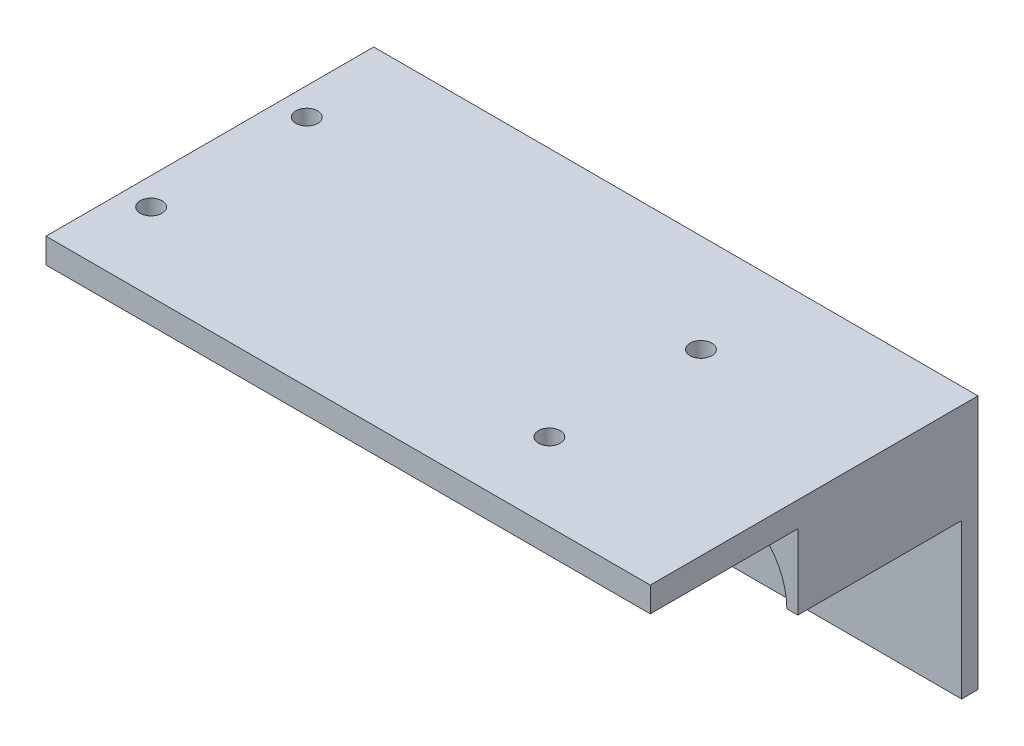
ISO-10303-21;
HEADER;
FILE_DESCRIPTION(('STEP AP214'),'2;1');
FILE_NAME('part.step','',(''),(''),'','','');
FILE_SCHEMA(('AUTOMOTIVE_DESIGN { 1 0 10303 214 1 1 1 1 }'));
ENDSEC;
DATA;
#1=APPLICATION_CONTEXT('core data for automotive mechanical design processes');
#2=APPLICATION_PROTOCOL_DEFINITION('international standard','automotive_design',2000,#1);
#3=PRODUCT_CONTEXT('',#1,'mechanical');
#4=PRODUCT('Part','Part','',(#3));
#5=PRODUCT_RELATED_PRODUCT_CATEGORY('part','',(#4));
#6=PRODUCT_DEFINITION_FORMATION('','',#4);
#7=PRODUCT_DEFINITION_CONTEXT('part definition',#1,'design');
#8=PRODUCT_DEFINITION('design','',#6,#7);
#9=PRODUCT_DEFINITION_SHAPE('','',#8);
#10=(LENGTH_UNIT() NAMED_UNIT(*) SI_UNIT(.MILLI.,.METRE.));
#11=(NAMED_UNIT(*) PLANE_ANGLE_UNIT() SI_UNIT($,.RADIAN.));
#12=(NAMED_UNIT(*) SI_UNIT($,.STERADIAN.) SOLID_ANGLE_UNIT());
#13=UNCERTAINTY_MEASURE_WITH_UNIT(LENGTH_MEASURE(1.E-05),#10,'distance_accuracy_value','');
#14=(GEOMETRIC_REPRESENTATION_CONTEXT(3) GLOBAL_UNCERTAINTY_ASSIGNED_CONTEXT((#13)) GLOBAL_UNIT_ASSIGNED_CONTEXT((#10,
#11,#12)) REPRESENTATION_CONTEXT('',''));
#15=CARTESIAN_POINT('',(0.,0.,0.));
#16=DIRECTION('',(0.,0.,1.));
#17=DIRECTION('',(1.,0.,0.));
#18=AXIS2_PLACEMENT_3D('',#15,#16,#17);
#19=CARTESIAN_POINT('',(60.0592660438776,30.0711771696162,-60.));
#20=DIRECTION('',(0.,0.,1.));
#21=DIRECTION('',(-1.,0.,0.));
#22=AXIS2_PLACEMENT_3D('',#19,#20,#21);
#23=CYLINDRICAL_SURFACE('',#22,11.);
#24=CARTESIAN_POINT('',(60.0592660438776,30.0711771696162,7.00000000000001));
#25=DIRECTION('',(0.,0.,-1.));
#26=DIRECTION('',(-1.,0.,0.));
#27=AXIS2_PLACEMENT_3D('',#24,#25,#26);
#28=CIRCLE('',#27,11.);
#29=CARTESIAN_POINT('',(49.0592660438776,30.0711771696162,7.00000000000001));
#30=VERTEX_POINT('',#29);
#31=EDGE_CURVE('E229',#30,#30,#28,.F.);
#32=ORIENTED_EDGE('',*,*,#31,.T.);
#33=EDGE_LOOP('',(#32));
#34=FACE_BOUND('',#33,.T.);
#35=CARTESIAN_POINT('',(60.0592660438776,30.0711771696162,-3.));
#36=DIRECTION('',(0.,0.,1.));
#37=DIRECTION('',(1.,0.,0.));
#38=AXIS2_PLACEMENT_3D('',#35,#36,#37);
#39=CIRCLE('',#38,11.);
#40=CARTESIAN_POINT('',(71.0592660438776,30.0711771696162,-3.));
#41=VERTEX_POINT('',#40);
#42=EDGE_CURVE('E246',#41,#41,#39,.T.);
#43=ORIENTED_EDGE('',*,*,#42,.F.);
#44=EDGE_LOOP('',(#43));
#45=FACE_BOUND('',#44,.T.);
#46=ADVANCED_FACE('F39',(#34,#45),#23,.F.);
#47=CARTESIAN_POINT('',(60.0592660438776,30.0711771696162,7.));
#48=DIRECTION('',(0.,0.,-1.));
#49=DIRECTION('',(1.,0.,0.));
#50=AXIS2_PLACEMENT_3D('',#47,#48,#49);
#51=CYLINDRICAL_SURFACE('',#50,13.);
#52=CARTESIAN_POINT('',(60.0592660438776,30.0711771696162,0.));
#53=DIRECTION('',(0.,0.,-1.));
#54=DIRECTION('',(-1.,0.,0.));
#55=AXIS2_PLACEMENT_3D('',#52,#53,#54);
#56=CIRCLE('',#55,13.);
#57=CARTESIAN_POINT('',(73.0592660438776,30.0711771696162,0.));
#58=VERTEX_POINT('',#57);
#59=CARTESIAN_POINT('',(55.9092660438776,17.7513760348575,0.));
#60=VERTEX_POINT('',#59);
#61=EDGE_CURVE('E237',#58,#60,#56,.T.);
#62=ORIENTED_EDGE('',*,*,#61,.F.);
#63=DIRECTION('',(0.,0.,-1.));
#64=VECTOR('',#63,1.);
#65=CARTESIAN_POINT('',(73.0592660438776,30.0711771696162,7.));
#66=LINE('',#65,#64);
#67=CARTESIAN_POINT('',(73.0592660438776,30.0711771696162,30.));
#68=VERTEX_POINT('',#67);
#69=EDGE_CURVE('E243',#68,#58,#66,.T.);
#70=ORIENTED_EDGE('',*,*,#69,.F.);
#71=CARTESIAN_POINT('',(60.0592660438776,30.0711771696162,30.));
#72=DIRECTION('',(0.,0.,-1.));
#73=DIRECTION('',(-1.,0.,0.));
#74=AXIS2_PLACEMENT_3D('',#71,#72,#73);
#75=CIRCLE('',#74,13.);
#76=CARTESIAN_POINT('',(49.5967813175664,22.3551928933423,30.));
#77=VERTEX_POINT('',#76);
#78=EDGE_CURVE('E220',#68,#77,#75,.T.);
#79=ORIENTED_EDGE('',*,*,#78,.T.);
#80=DIRECTION('',(0.,0.,-1.));
#81=VECTOR('',#80,1.);
#82=CARTESIAN_POINT('',(49.5967813175664,22.3551928933423,28.5));
#83=LINE('',#82,#81);
#84=CARTESIAN_POINT('',(49.5967813175664,22.3551928933423,5.));
#85=VERTEX_POINT('',#84);
#86=EDGE_CURVE('E211',#77,#85,#83,.T.);
#87=ORIENTED_EDGE('',*,*,#86,.T.);
#88=CARTESIAN_POINT('',(60.0592660438776,30.0711771696162,5.));
#89=DIRECTION('',(0.,0.,-1.));
#90=DIRECTION('',(-1.,0.,0.));
#91=AXIS2_PLACEMENT_3D('',#88,#89,#90);
#92=CIRCLE('',#91,13.);
#93=CARTESIAN_POINT('',(55.9092660438776,17.7513760348575,5.));
#94=VERTEX_POINT('',#93);
#95=EDGE_CURVE('E175',#94,#85,#92,.T.);
#96=ORIENTED_EDGE('',*,*,#95,.F.);
#97=DIRECTION('',(0.,0.,-1.));
#98=VECTOR('',#97,1.);
#99=CARTESIAN_POINT('',(55.9092660438776,17.7513760348575,7.));
#100=LINE('',#99,#98);
#101=EDGE_CURVE('E149',#60,#94,#100,.F.);
#102=ORIENTED_EDGE('',*,*,#101,.F.);
#103=EDGE_LOOP('',(#62,#70,#79,#87,#96,#102));
#104=FACE_BOUND('',#103,.T.);
#105=ADVANCED_FACE('F414',(#104),#51,.T.);
#106=CARTESIAN_POINT('',(47.0592660438776,0.,7.));
#107=DIRECTION('',(-1.,0.,0.));
#108=DIRECTION('',(0.,0.,-1.));
#109=AXIS2_PLACEMENT_3D('',#106,#107,#108);
#110=PLANE('',#109);
#111=DIRECTION('',(0.,-1.,0.));
#112=VECTOR('',#111,1.);
#113=CARTESIAN_POINT('',(47.0592660438776,0.,5.));
#114=LINE('',#113,#112);
#115=CARTESIAN_POINT('',(47.0592660438776,42.,5.));
#116=VERTEX_POINT('',#115);
#117=CARTESIAN_POINT('',(47.0592660438776,31.650981403164,5.));
#118=VERTEX_POINT('',#117);
#119=EDGE_CURVE('E168',#116,#118,#114,.T.);
#120=ORIENTED_EDGE('',*,*,#119,.T.);
#121=DIRECTION('',(0.,0.,-1.));
#122=VECTOR('',#121,1.);
#123=CARTESIAN_POINT('',(47.0592660438776,31.650981403164,57.));
#124=LINE('',#123,#122);
#125=CARTESIAN_POINT('',(47.0592660438776,31.650981403164,30.));
#126=VERTEX_POINT('',#125);
#127=EDGE_CURVE('E11',#126,#118,#124,.T.);
#128=ORIENTED_EDGE('',*,*,#127,.F.);
#129=DIRECTION('',(0.,1.,0.));
#130=VECTOR('',#129,1.);
#131=CARTESIAN_POINT('',(47.0592660438776,30.0711771696162,30.));
#132=LINE('',#131,#130);
#133=CARTESIAN_POINT('',(47.0592660438776,42.,30.));
#134=VERTEX_POINT('',#133);
#135=EDGE_CURVE('E217',#126,#134,#132,.T.);
#136=ORIENTED_EDGE('',*,*,#135,.T.);
#137=DIRECTION('',(0.,0.,-1.));
#138=VECTOR('',#137,1.);
#139=CARTESIAN_POINT('',(47.0592660438776,42.,7.));
#140=LINE('',#139,#138);
#141=EDGE_CURVE('E240',#134,#116,#140,.T.);
#142=ORIENTED_EDGE('',*,*,#141,.T.);
#143=EDGE_LOOP('',(#120,#128,#136,#142));
#144=FACE_BOUND('',#143,.T.);
#145=ADVANCED_FACE('F420',(#144),#110,.T.);
#146=CARTESIAN_POINT('',(60.0592660438776,30.0711771696162,23.));
#147=DIRECTION('',(0.,0.,1.));
#148=DIRECTION('',(-1.,0.,0.));
#149=AXIS2_PLACEMENT_3D('',#146,#147,#148);
#150=PLANE('',#149);
#151=CARTESIAN_POINT('',(60.0592660438776,30.0711771696162,23.));
#152=DIRECTION('',(0.,0.,-1.));
#153=DIRECTION('',(-1.,0.,0.));
#154=AXIS2_PLACEMENT_3D('',#151,#152,#153);
#155=CIRCLE('',#154,4.15);
#156=CARTESIAN_POINT('',(55.9092660438776,30.0711771696162,23.));
#157=VERTEX_POINT('',#156);
#158=EDGE_CURVE('E226',#157,#157,#155,.T.);
#159=ORIENTED_EDGE('',*,*,#158,.T.);
#160=EDGE_LOOP('',(#159));
#161=FACE_BOUND('',#160,.T.);
#162=CARTESIAN_POINT('',(60.0592660438776,30.0711771696162,23.));
#163=DIRECTION('',(0.,0.,-1.));
#164=DIRECTION('',(-1.,0.,0.));
#165=AXIS2_PLACEMENT_3D('',#162,#163,#164);
#166=CIRCLE('',#165,11.);
#167=CARTESIAN_POINT('',(49.0592660438776,30.0711771696162,23.));
#168=VERTEX_POINT('',#167);
#169=EDGE_CURVE('E48',#168,#168,#166,.F.);
#170=ORIENTED_EDGE('',*,*,#169,.T.);
#171=EDGE_LOOP('',(#170));
#172=FACE_BOUND('',#171,.T.);
#173=ADVANCED_FACE('F480',(#161,#172),#150,.T.);
#174=CARTESIAN_POINT('',(0.,0.,0.));
#175=DIRECTION('',(0.,0.,-1.));
#176=DIRECTION('',(1.,0.,0.));
#177=AXIS2_PLACEMENT_3D('',#174,#175,#176);
#178=PLANE('',#177);
#179=DIRECTION('',(1.,0.,0.));
#180=VECTOR('',#179,1.);
#181=CARTESIAN_POINT('',(0.,0.,0.));
#182=LINE('',#181,#180);
#183=CARTESIAN_POINT('',(55.9092660438776,0.,0.));
#184=VERTEX_POINT('',#183);
#185=CARTESIAN_POINT('',(110.639208531659,0.,0.));
#186=VERTEX_POINT('',#185);
#187=EDGE_CURVE('E165',#184,#186,#182,.T.);
#188=ORIENTED_EDGE('',*,*,#187,.T.);
#189=DIRECTION('',(0.,-1.,0.));
#190=VECTOR('',#189,1.);
#191=CARTESIAN_POINT('',(110.639208531659,0.,0.));
#192=LINE('',#191,#190);
#193=CARTESIAN_POINT('',(110.639208531659,28.2999999999964,0.));
#194=VERTEX_POINT('',#193);
#195=EDGE_CURVE('E341',#194,#186,#192,.T.);
#196=ORIENTED_EDGE('',*,*,#195,.F.);
#197=DIRECTION('',(-1.,0.,0.));
#198=VECTOR('',#197,1.);
#199=CARTESIAN_POINT('',(0.,28.2999999999964,0.));
#200=LINE('',#199,#198);
#201=CARTESIAN_POINT('',(108.639208531659,28.2999999999964,0.));
#202=VERTEX_POINT('',#201);
#203=EDGE_CURVE('E251',#194,#202,#200,.T.);
#204=ORIENTED_EDGE('',*,*,#203,.T.);
#205=CARTESIAN_POINT('',(95.6392085316593,28.2999999999999,0.));
#206=DIRECTION('',(0.,0.,1.));
#207=DIRECTION('',(1.,0.,0.));
#208=AXIS2_PLACEMENT_3D('',#205,#206,#207);
#209=CIRCLE('',#208,13.);
#210=CARTESIAN_POINT('',(82.760430195426,30.0711771696162,0.));
#211=VERTEX_POINT('',#210);
#212=EDGE_CURVE('E260',#202,#211,#209,.T.);
#213=ORIENTED_EDGE('',*,*,#212,.T.);
#214=DIRECTION('',(1.,0.,0.));
#215=VECTOR('',#214,1.);
#216=CARTESIAN_POINT('',(0.,30.0711771696162,0.));
#217=LINE('',#216,#215);
#218=EDGE_CURVE('E234',#58,#211,#217,.T.);
#219=ORIENTED_EDGE('',*,*,#218,.F.);
#220=ORIENTED_EDGE('',*,*,#61,.T.);
#221=DIRECTION('',(0.,-1.,0.));
#222=VECTOR('',#221,1.);
#223=CARTESIAN_POINT('',(55.9092660438776,0.,0.));
#224=LINE('',#223,#222);
#225=EDGE_CURVE('E63',#60,#184,#224,.T.);
#226=ORIENTED_EDGE('',*,*,#225,.T.);
#227=EDGE_LOOP('',(#188,#196,#204,#213,#219,#220,#226));
#228=FACE_BOUND('',#227,.T.);
#229=CARTESIAN_POINT('',(85.6392085316545,28.2999999999964,0.));
#230=DIRECTION('',(0.,0.,1.));
#231=DIRECTION('',(1.,0.,0.));
#232=AXIS2_PLACEMENT_3D('',#229,#230,#231);
#233=CIRCLE('',#232,1.54999999999999);
#234=CARTESIAN_POINT('',(87.1892085316545,28.2999999999964,0.));
#235=VERTEX_POINT('',#234);
#236=EDGE_CURVE('E338',#235,#235,#233,.T.);
#237=ORIENTED_EDGE('',*,*,#236,.F.);
#238=EDGE_LOOP('',(#237));
#239=FACE_BOUND('',#238,.T.);
#240=CARTESIAN_POINT('',(95.6392085316592,38.3000000000002,0.));
#241=DIRECTION('',(0.,0.,1.));
#242=DIRECTION('',(1.,0.,0.));
#243=AXIS2_PLACEMENT_3D('',#240,#241,#242);
#244=CIRCLE('',#243,1.54999999999999);
#245=CARTESIAN_POINT('',(97.1892085316592,38.3000000000002,0.));
#246=VERTEX_POINT('',#245);
#247=EDGE_CURVE('E292',#246,#246,#244,.T.);
#248=ORIENTED_EDGE('',*,*,#247,.F.);
#249=EDGE_LOOP('',(#248));
#250=FACE_BOUND('',#249,.T.);
#251=CARTESIAN_POINT('',(105.639208531663,28.2999999999955,0.));
#252=DIRECTION('',(0.,0.,1.));
#253=DIRECTION('',(1.,0.,0.));
#254=AXIS2_PLACEMENT_3D('',#251,#252,#253);
#255=CIRCLE('',#254,1.54999999999999);
#256=CARTESIAN_POINT('',(107.189208531663,28.2999999999955,0.));
#257=VERTEX_POINT('',#256);
#258=EDGE_CURVE('E332',#257,#257,#255,.T.);
#259=ORIENTED_EDGE('',*,*,#258,.F.);
#260=EDGE_LOOP('',(#259));
#261=FACE_BOUND('',#260,.T.);
#262=CARTESIAN_POINT('',(95.6392085316593,28.2999999999999,0.));
#263=DIRECTION('',(0.,0.,1.));
#264=DIRECTION('',(1.,0.,0.));
#265=AXIS2_PLACEMENT_3D('',#262,#263,#264);
#266=CIRCLE('',#265,7.09999999999999);
#267=CARTESIAN_POINT('',(102.739208531659,28.2999999999999,0.));
#268=VERTEX_POINT('',#267);
#269=EDGE_CURVE('E335',#268,#268,#266,.T.);
#270=ORIENTED_EDGE('',*,*,#269,.F.);
#271=EDGE_LOOP('',(#270));
#272=FACE_BOUND('',#271,.T.);
#273=CARTESIAN_POINT('',(95.6392085316584,18.2999999999916,0.));
#274=DIRECTION('',(0.,0.,1.));
#275=DIRECTION('',(1.,0.,0.));
#276=AXIS2_PLACEMENT_3D('',#273,#274,#275);
#277=CIRCLE('',#276,1.54999999999999);
#278=CARTESIAN_POINT('',(97.1892085316584,18.2999999999916,0.));
#279=VERTEX_POINT('',#278);
#280=EDGE_CURVE('E297',#279,#279,#277,.T.);
#281=ORIENTED_EDGE('',*,*,#280,.F.);
#282=EDGE_LOOP('',(#281));
#283=FACE_BOUND('',#282,.T.);
#284=ADVANCED_FACE('F409',(#228,#239,#250,#261,#272,#283),#178,.F.);
#285=CARTESIAN_POINT('',(110.639208531659,42.,57.));
#286=DIRECTION('',(0.,1.,0.));
#287=DIRECTION('',(0.,0.,-1.));
#288=AXIS2_PLACEMENT_3D('',#285,#286,#287);
#289=PLANE('',#288);
#290=CARTESIAN_POINT('',(5.,42.,14.25));
#291=DIRECTION('',(0.,1.,0.));
#292=DIRECTION('',(0.,0.,1.));
#293=AXIS2_PLACEMENT_3D('',#290,#291,#292);
#294=CIRCLE('',#293,2.);
#295=CARTESIAN_POINT('',(5.,42.,16.25));
#296=VERTEX_POINT('',#295);
#297=EDGE_CURVE('E191',#296,#296,#294,.T.);
#298=ORIENTED_EDGE('',*,*,#297,.T.);
#299=EDGE_LOOP('',(#298));
#300=FACE_BOUND('',#299,.T.);
#301=CARTESIAN_POINT('',(77.9098481196518,42.,42.75));
#302=DIRECTION('',(0.,1.,0.));
#303=DIRECTION('',(0.,0.,1.));
#304=AXIS2_PLACEMENT_3D('',#301,#302,#303);
#305=CIRCLE('',#304,2.);
#306=CARTESIAN_POINT('',(77.9098481196518,42.,44.75));
#307=VERTEX_POINT('',#306);
#308=EDGE_CURVE('E195',#307,#307,#305,.T.);
#309=ORIENTED_EDGE('',*,*,#308,.T.);
#310=EDGE_LOOP('',(#309));
#311=FACE_BOUND('',#310,.T.);
#312=CARTESIAN_POINT('',(5.,42.,42.75));
#313=DIRECTION('',(0.,1.,0.));
#314=DIRECTION('',(0.,0.,1.));
#315=AXIS2_PLACEMENT_3D('',#312,#313,#314);
#316=CIRCLE('',#315,2.);
#317=CARTESIAN_POINT('',(5.,42.,44.75));
#318=VERTEX_POINT('',#317);
#319=EDGE_CURVE('E190',#318,#318,#316,.T.);
#320=ORIENTED_EDGE('',*,*,#319,.T.);
#321=EDGE_LOOP('',(#320));
#322=FACE_BOUND('',#321,.T.);
#323=ORIENTED_EDGE('',*,*,#141,.F.);
#324=DIRECTION('',(1.,0.,0.));
#325=VECTOR('',#324,1.);
#326=CARTESIAN_POINT('',(0.,42.,30.));
#327=LINE('',#326,#325);
#328=CARTESIAN_POINT('',(110.639208531659,42.,30.));
#329=VERTEX_POINT('',#328);
#330=EDGE_CURVE('E256',#134,#329,#327,.T.);
#331=ORIENTED_EDGE('',*,*,#330,.T.);
#332=DIRECTION('',(0.,0.,-1.));
#333=VECTOR('',#332,1.);
#334=CARTESIAN_POINT('',(110.639208531659,42.,57.));
#335=LINE('',#334,#333);
#336=CARTESIAN_POINT('',(110.639208531659,42.,57.));
#337=VERTEX_POINT('',#336);
#338=EDGE_CURVE('E289',#337,#329,#335,.T.);
#339=ORIENTED_EDGE('',*,*,#338,.F.);
#340=DIRECTION('',(-1.,0.,0.));
#341=VECTOR('',#340,1.);
#342=CARTESIAN_POINT('',(110.639208531659,42.,57.));
#343=LINE('',#342,#341);
#344=CARTESIAN_POINT('',(0.,42.,57.));
#345=VERTEX_POINT('',#344);
#346=EDGE_CURVE('E271',#337,#345,#343,.T.);
#347=ORIENTED_EDGE('',*,*,#346,.T.);
#348=DIRECTION('',(0.,0.,-1.));
#349=VECTOR('',#348,1.);
#350=CARTESIAN_POINT('',(0.,42.,57.));
#351=LINE('',#350,#349);
#352=CARTESIAN_POINT('',(0.,42.,5.));
#353=VERTEX_POINT('',#352);
#354=EDGE_CURVE('E286',#345,#353,#351,.T.);
#355=ORIENTED_EDGE('',*,*,#354,.T.);
#356=DIRECTION('',(1.,0.,0.));
#357=VECTOR('',#356,1.);
#358=CARTESIAN_POINT('',(0.,42.,5.));
#359=LINE('',#358,#357);
#360=EDGE_CURVE('E152',#353,#116,#359,.T.);
#361=ORIENTED_EDGE('',*,*,#360,.T.);
#362=EDGE_LOOP('',(#323,#331,#339,#347,#355,#361));
#363=FACE_BOUND('',#362,.T.);
#364=ADVANCED_FACE('F396',(#300,#311,#322,#363),#289,.F.);
#365=CARTESIAN_POINT('',(110.639208531659,0.,-3.));
#366=DIRECTION('',(1.,0.,0.));
#367=DIRECTION('',(0.,1.,0.));
#368=AXIS2_PLACEMENT_3D('',#365,#366,#367);
#369=PLANE('',#368);
#370=ORIENTED_EDGE('',*,*,#195,.T.);
#371=DIRECTION('',(0.,0.,1.));
#372=VECTOR('',#371,1.);
#373=CARTESIAN_POINT('',(110.639208531659,0.,-3.));
#374=LINE('',#373,#372);
#375=CARTESIAN_POINT('',(110.639208531659,0.,-3.));
#376=VERTEX_POINT('',#375);
#377=EDGE_CURVE('E329',#376,#186,#374,.T.);
#378=ORIENTED_EDGE('',*,*,#377,.F.);
#379=DIRECTION('',(0.,-1.,0.));
#380=VECTOR('',#379,1.);
#381=CARTESIAN_POINT('',(110.639208531659,0.,-3.));
#382=LINE('',#381,#380);
#383=CARTESIAN_POINT('',(110.639208531659,46.57,-3.));
#384=VERTEX_POINT('',#383);
#385=EDGE_CURVE('E306',#384,#376,#382,.T.);
#386=ORIENTED_EDGE('',*,*,#385,.F.);
#387=DIRECTION('',(0.,0.,-1.));
#388=VECTOR('',#387,1.);
#389=CARTESIAN_POINT('',(110.639208531659,46.57,57.));
#390=LINE('',#389,#388);
#391=CARTESIAN_POINT('',(110.639208531659,46.57,57.));
#392=VERTEX_POINT('',#391);
#393=EDGE_CURVE('E279',#392,#384,#390,.T.);
#394=ORIENTED_EDGE('',*,*,#393,.F.);
#395=DIRECTION('',(0.,-1.,0.));
#396=VECTOR('',#395,1.);
#397=CARTESIAN_POINT('',(110.639208531659,42.,57.));
#398=LINE('',#397,#396);
#399=EDGE_CURVE('E269',#392,#337,#398,.T.);
#400=ORIENTED_EDGE('',*,*,#399,.T.);
#401=ORIENTED_EDGE('',*,*,#338,.T.);
#402=DIRECTION('',(0.,-1.,0.));
#403=VECTOR('',#402,1.);
#404=CARTESIAN_POINT('',(110.639208531659,0.,30.));
#405=LINE('',#404,#403);
#406=CARTESIAN_POINT('',(110.639208531659,28.2999999999964,30.));
#407=VERTEX_POINT('',#406);
#408=EDGE_CURVE('E253',#329,#407,#405,.T.);
#409=ORIENTED_EDGE('',*,*,#408,.T.);
#410=DIRECTION('',(0.,0.,-1.));
#411=VECTOR('',#410,1.);
#412=CARTESIAN_POINT('',(110.639208531659,28.2999999999964,30.));
#413=LINE('',#412,#411);
#414=EDGE_CURVE('E265',#407,#194,#413,.T.);
#415=ORIENTED_EDGE('',*,*,#414,.T.);
#416=EDGE_LOOP('',(#370,#378,#386,#394,#400,#401,#409,#415));
#417=FACE_BOUND('',#416,.T.);
#418=ADVANCED_FACE('F389',(#417),#369,.T.);
#419=CARTESIAN_POINT('',(0.,0.,-3.));
#420=DIRECTION('',(-1.,0.,0.));
#421=DIRECTION('',(0.,-1.,0.));
#422=AXIS2_PLACEMENT_3D('',#419,#420,#421);
#423=PLANE('',#422);
#424=ORIENTED_EDGE('',*,*,#354,.F.);
#425=DIRECTION('',(0.,1.,0.));
#426=VECTOR('',#425,1.);
#427=CARTESIAN_POINT('',(0.,42.,57.));
#428=LINE('',#427,#426);
#429=CARTESIAN_POINT('',(0.,46.57,57.));
#430=VERTEX_POINT('',#429);
#431=EDGE_CURVE('E274',#345,#430,#428,.T.);
#432=ORIENTED_EDGE('',*,*,#431,.T.);
#433=DIRECTION('',(0.,0.,-1.));
#434=VECTOR('',#433,1.);
#435=CARTESIAN_POINT('',(0.,46.57,57.));
#436=LINE('',#435,#434);
#437=CARTESIAN_POINT('',(0.,46.57,-3.));
#438=VERTEX_POINT('',#437);
#439=EDGE_CURVE('E283',#430,#438,#436,.T.);
#440=ORIENTED_EDGE('',*,*,#439,.T.);
#441=DIRECTION('',(0.,1.,0.));
#442=VECTOR('',#441,1.);
#443=CARTESIAN_POINT('',(0.,0.,-3.));
#444=LINE('',#443,#442);
#445=CARTESIAN_POINT('',(0.,0.,-3.));
#446=VERTEX_POINT('',#445);
#447=EDGE_CURVE('E309',#446,#438,#444,.T.);
#448=ORIENTED_EDGE('',*,*,#447,.F.);
#449=DIRECTION('',(0.,0.,1.));
#450=VECTOR('',#449,1.);
#451=CARTESIAN_POINT('',(0.,0.,-3.));
#452=LINE('',#451,#450);
#453=CARTESIAN_POINT('',(0.,0.,5.));
#454=VERTEX_POINT('',#453);
#455=EDGE_CURVE('E348',#446,#454,#452,.T.);
#456=ORIENTED_EDGE('',*,*,#455,.T.);
#457=DIRECTION('',(0.,-1.,0.));
#458=VECTOR('',#457,1.);
#459=CARTESIAN_POINT('',(0.,0.,5.));
#460=LINE('',#459,#458);
#461=EDGE_CURVE('E157',#353,#454,#460,.T.);
#462=ORIENTED_EDGE('',*,*,#461,.F.);
#463=EDGE_LOOP('',(#424,#432,#440,#448,#456,#462));
#464=FACE_BOUND('',#463,.T.);
#465=ADVANCED_FACE('F383',(#464),#423,.T.);
#466=CARTESIAN_POINT('',(30.,22.0000000000006,-3.));
#467=DIRECTION('',(0.,0.,1.));
#468=DIRECTION('',(-1.,0.,0.));
#469=AXIS2_PLACEMENT_3D('',#466,#467,#468);
#470=CYLINDRICAL_SURFACE('',#469,10.1);
#471=CARTESIAN_POINT('',(30.,22.0000000000006,-3.));
#472=DIRECTION('',(0.,0.,1.));
#473=DIRECTION('',(1.,0.,0.));
#474=AXIS2_PLACEMENT_3D('',#471,#472,#473);
#475=CIRCLE('',#474,10.1);
#476=CARTESIAN_POINT('',(40.1,22.0000000000006,-3.));
#477=VERTEX_POINT('',#476);
#478=EDGE_CURVE('E323',#477,#477,#475,.T.);
#479=ORIENTED_EDGE('',*,*,#478,.F.);
#480=EDGE_LOOP('',(#479));
#481=FACE_BOUND('',#480,.T.);
#482=CARTESIAN_POINT('',(30.,22.0000000000006,5.));
#483=DIRECTION('',(0.,0.,1.));
#484=DIRECTION('',(1.,0.,0.));
#485=AXIS2_PLACEMENT_3D('',#482,#483,#484);
#486=CIRCLE('',#485,10.1);
#487=CARTESIAN_POINT('',(40.1,22.0000000000006,5.));
#488=VERTEX_POINT('',#487);
#489=EDGE_CURVE('E187',#488,#488,#486,.T.);
#490=ORIENTED_EDGE('',*,*,#489,.T.);
#491=EDGE_LOOP('',(#490));
#492=FACE_BOUND('',#491,.T.);
#493=ADVANCED_FACE('F518',(#481,#492),#470,.F.);
#494=CARTESIAN_POINT('',(42.9903810567664,14.5000000000003,-3.));
#495=DIRECTION('',(0.,0.,1.));
#496=DIRECTION('',(-1.,0.,0.));
#497=AXIS2_PLACEMENT_3D('',#494,#495,#496);
#498=CYLINDRICAL_SURFACE('',#497,1.54999999999999);
#499=CARTESIAN_POINT('',(42.9903810567664,14.5000000000003,-3.));
#500=DIRECTION('',(0.,0.,1.));
#501=DIRECTION('',(1.,0.,0.));
#502=AXIS2_PLACEMENT_3D('',#499,#500,#501);
#503=CIRCLE('',#502,1.54999999999999);
#504=CARTESIAN_POINT('',(44.5403810567664,14.5000000000003,-3.));
#505=VERTEX_POINT('',#504);
#506=EDGE_CURVE('E320',#505,#505,#503,.T.);
#507=ORIENTED_EDGE('',*,*,#506,.F.);
#508=EDGE_LOOP('',(#507));
#509=FACE_BOUND('',#508,.T.);
#510=CARTESIAN_POINT('',(42.9903810567664,14.5000000000003,5.));
#511=DIRECTION('',(0.,0.,1.));
#512=DIRECTION('',(1.,0.,0.));
#513=AXIS2_PLACEMENT_3D('',#510,#511,#512);
#514=CIRCLE('',#513,1.54999999999999);
#515=CARTESIAN_POINT('',(44.5403810567664,14.5000000000003,5.));
#516=VERTEX_POINT('',#515);
#517=EDGE_CURVE('E184',#516,#516,#514,.T.);
#518=ORIENTED_EDGE('',*,*,#517,.T.);
#519=EDGE_LOOP('',(#518));
#520=FACE_BOUND('',#519,.T.);
#521=ADVANCED_FACE('F525',(#509,#520),#498,.F.);
#522=CARTESIAN_POINT('',(17.0096189432336,14.5000000000003,-3.));
#523=DIRECTION('',(0.,0.,1.));
#524=DIRECTION('',(-1.,0.,0.));
#525=AXIS2_PLACEMENT_3D('',#522,#523,#524);
#526=CYLINDRICAL_SURFACE('',#525,1.55000000000001);
#527=CARTESIAN_POINT('',(17.0096189432336,14.5000000000003,-3.));
#528=DIRECTION('',(0.,0.,1.));
#529=DIRECTION('',(1.,0.,0.));
#530=AXIS2_PLACEMENT_3D('',#527,#528,#529);
#531=CIRCLE('',#530,1.55000000000001);
#532=CARTESIAN_POINT('',(18.5596189432336,14.5000000000003,-3.));
#533=VERTEX_POINT('',#532);
#534=EDGE_CURVE('E317',#533,#533,#531,.T.);
#535=ORIENTED_EDGE('',*,*,#534,.F.);
#536=EDGE_LOOP('',(#535));
#537=FACE_BOUND('',#536,.T.);
#538=CARTESIAN_POINT('',(17.0096189432336,14.5000000000003,5.));
#539=DIRECTION('',(0.,0.,1.));
#540=DIRECTION('',(1.,0.,0.));
#541=AXIS2_PLACEMENT_3D('',#538,#539,#540);
#542=CIRCLE('',#541,1.55000000000001);
#543=CARTESIAN_POINT('',(18.5596189432336,14.5000000000003,5.));
#544=VERTEX_POINT('',#543);
#545=EDGE_CURVE('E181',#544,#544,#542,.T.);
#546=ORIENTED_EDGE('',*,*,#545,.T.);
#547=EDGE_LOOP('',(#546));
#548=FACE_BOUND('',#547,.T.);
#549=ADVANCED_FACE('F533',(#537,#548),#526,.F.);
#550=CARTESIAN_POINT('',(30.,37.,-3.));
#551=DIRECTION('',(0.,0.,1.));
#552=DIRECTION('',(-1.,0.,0.));
#553=AXIS2_PLACEMENT_3D('',#550,#551,#552);
#554=CYLINDRICAL_SURFACE('',#553,1.55);
#555=CARTESIAN_POINT('',(30.,37.,-3.));
#556=DIRECTION('',(0.,0.,1.));
#557=DIRECTION('',(1.,0.,0.));
#558=AXIS2_PLACEMENT_3D('',#555,#556,#557);
#559=CIRCLE('',#558,1.55);
#560=CARTESIAN_POINT('',(31.55,37.,-3.));
#561=VERTEX_POINT('',#560);
#562=EDGE_CURVE('E314',#561,#561,#559,.T.);
#563=ORIENTED_EDGE('',*,*,#562,.F.);
#564=EDGE_LOOP('',(#563));
#565=FACE_BOUND('',#564,.T.);
#566=CARTESIAN_POINT('',(30.,37.,5.));
#567=DIRECTION('',(0.,0.,1.));
#568=DIRECTION('',(1.,0.,0.));
#569=AXIS2_PLACEMENT_3D('',#566,#567,#568);
#570=CIRCLE('',#569,1.55);
#571=CARTESIAN_POINT('',(31.55,37.,5.));
#572=VERTEX_POINT('',#571);
#573=EDGE_CURVE('E178',#572,#572,#570,.T.);
#574=ORIENTED_EDGE('',*,*,#573,.T.);
#575=EDGE_LOOP('',(#574));
#576=FACE_BOUND('',#575,.T.);
#577=ADVANCED_FACE('F541',(#565,#576),#554,.F.);
#578=CARTESIAN_POINT('',(0.,0.,-3.));
#579=DIRECTION('',(0.,1.,0.));
#580=DIRECTION('',(0.,0.,-1.));
#581=AXIS2_PLACEMENT_3D('',#578,#579,#580);
#582=PLANE('',#581);
#583=ORIENTED_EDGE('',*,*,#455,.F.);
#584=DIRECTION('',(1.,0.,0.));
#585=VECTOR('',#584,1.);
#586=CARTESIAN_POINT('',(0.,0.,-3.));
#587=LINE('',#586,#585);
#588=EDGE_CURVE('E312',#446,#376,#587,.T.);
#589=ORIENTED_EDGE('',*,*,#588,.T.);
#590=ORIENTED_EDGE('',*,*,#377,.T.);
#591=ORIENTED_EDGE('',*,*,#187,.F.);
#592=DIRECTION('',(0.,0.,1.));
#593=VECTOR('',#592,1.);
#594=CARTESIAN_POINT('',(55.9092660438776,0.,0.));
#595=LINE('',#594,#593);
#596=CARTESIAN_POINT('',(55.9092660438776,0.,5.));
#597=VERTEX_POINT('',#596);
#598=EDGE_CURVE('E148',#184,#597,#595,.T.);
#599=ORIENTED_EDGE('',*,*,#598,.T.);
#600=DIRECTION('',(1.,0.,0.));
#601=VECTOR('',#600,1.);
#602=CARTESIAN_POINT('',(0.,0.,5.));
#603=LINE('',#602,#601);
#604=EDGE_CURVE('E151',#454,#597,#603,.T.);
#605=ORIENTED_EDGE('',*,*,#604,.F.);
#606=EDGE_LOOP('',(#583,#589,#590,#591,#599,#605));
#607=FACE_BOUND('',#606,.T.);
#608=ADVANCED_FACE('F163',(#607),#582,.F.);
#609=CARTESIAN_POINT('',(85.6392085316545,28.2999999999964,-3.));
#610=DIRECTION('',(0.,0.,1.));
#611=DIRECTION('',(-1.,0.,0.));
#612=AXIS2_PLACEMENT_3D('',#609,#610,#611);
#613=CYLINDRICAL_SURFACE('',#612,1.54999999999999);
#614=CARTESIAN_POINT('',(85.6392085316545,28.2999999999964,-3.));
#615=DIRECTION('',(0.,0.,1.));
#616=DIRECTION('',(1.,0.,0.));
#617=AXIS2_PLACEMENT_3D('',#614,#615,#616);
#618=CIRCLE('',#617,1.54999999999999);
#619=CARTESIAN_POINT('',(87.1892085316545,28.2999999999964,-3.));
#620=VERTEX_POINT('',#619);
#621=EDGE_CURVE('E303',#620,#620,#618,.T.);
#622=ORIENTED_EDGE('',*,*,#621,.F.);
#623=EDGE_LOOP('',(#622));
#624=FACE_BOUND('',#623,.T.);
#625=ORIENTED_EDGE('',*,*,#236,.T.);
#626=EDGE_LOOP('',(#625));
#627=FACE_BOUND('',#626,.T.);
#628=ADVANCED_FACE('F556',(#624,#627),#613,.F.);
#629=CARTESIAN_POINT('',(95.6392085316593,28.2999999999999,-3.));
#630=DIRECTION('',(0.,0.,1.));
#631=DIRECTION('',(-1.,0.,0.));
#632=AXIS2_PLACEMENT_3D('',#629,#630,#631);
#633=CYLINDRICAL_SURFACE('',#632,7.09999999999999);
#634=CARTESIAN_POINT('',(95.6392085316593,28.2999999999999,-3.));
#635=DIRECTION('',(0.,0.,1.));
#636=DIRECTION('',(1.,0.,0.));
#637=AXIS2_PLACEMENT_3D('',#634,#635,#636);
#638=CIRCLE('',#637,7.09999999999999);
#639=CARTESIAN_POINT('',(102.739208531659,28.2999999999999,-3.));
#640=VERTEX_POINT('',#639);
#641=EDGE_CURVE('E300',#640,#640,#638,.T.);
#642=ORIENTED_EDGE('',*,*,#641,.F.);
#643=EDGE_LOOP('',(#642));
#644=FACE_BOUND('',#643,.T.);
#645=ORIENTED_EDGE('',*,*,#269,.T.);
#646=EDGE_LOOP('',(#645));
#647=FACE_BOUND('',#646,.T.);
#648=ADVANCED_FACE('F563',(#644,#647),#633,.F.);
#649=CARTESIAN_POINT('',(105.639208531663,28.2999999999955,-3.));
#650=DIRECTION('',(0.,0.,1.));
#651=DIRECTION('',(-1.,0.,0.));
#652=AXIS2_PLACEMENT_3D('',#649,#650,#651);
#653=CYLINDRICAL_SURFACE('',#652,1.54999999999999);
#654=CARTESIAN_POINT('',(105.639208531663,28.2999999999955,-3.));
#655=DIRECTION('',(0.,0.,1.));
#656=DIRECTION('',(1.,0.,0.));
#657=AXIS2_PLACEMENT_3D('',#654,#655,#656);
#658=CIRCLE('',#657,1.54999999999999);
#659=CARTESIAN_POINT('',(107.189208531663,28.2999999999955,-3.));
#660=VERTEX_POINT('',#659);
#661=EDGE_CURVE('E296',#660,#660,#658,.T.);
#662=ORIENTED_EDGE('',*,*,#661,.F.);
#663=EDGE_LOOP('',(#662));
#664=FACE_BOUND('',#663,.T.);
#665=ORIENTED_EDGE('',*,*,#258,.T.);
#666=EDGE_LOOP('',(#665));
#667=FACE_BOUND('',#666,.T.);
#668=ADVANCED_FACE('F571',(#664,#667),#653,.F.);
#669=CARTESIAN_POINT('',(95.6392085316592,38.3000000000002,-3.));
#670=DIRECTION('',(0.,0.,1.));
#671=DIRECTION('',(-1.,0.,0.));
#672=AXIS2_PLACEMENT_3D('',#669,#670,#671);
#673=CYLINDRICAL_SURFACE('',#672,1.54999999999999);
#674=CARTESIAN_POINT('',(95.6392085316592,38.3000000000002,-3.));
#675=DIRECTION('',(0.,0.,1.));
#676=DIRECTION('',(1.,0.,0.));
#677=AXIS2_PLACEMENT_3D('',#674,#675,#676);
#678=CIRCLE('',#677,1.54999999999999);
#679=CARTESIAN_POINT('',(97.1892085316592,38.3000000000002,-3.));
#680=VERTEX_POINT('',#679);
#681=EDGE_CURVE('E293',#680,#680,#678,.T.);
#682=ORIENTED_EDGE('',*,*,#681,.F.);
#683=EDGE_LOOP('',(#682));
#684=FACE_BOUND('',#683,.T.);
#685=ORIENTED_EDGE('',*,*,#247,.T.);
#686=EDGE_LOOP('',(#685));
#687=FACE_BOUND('',#686,.T.);
#688=ADVANCED_FACE('F41',(#684,#687),#673,.F.);
#689=CARTESIAN_POINT('',(95.6392085316584,18.2999999999916,-3.));
#690=DIRECTION('',(0.,0.,1.));
#691=DIRECTION('',(-1.,0.,0.));
#692=AXIS2_PLACEMENT_3D('',#689,#690,#691);
#693=CYLINDRICAL_SURFACE('',#692,1.54999999999999);
#694=CARTESIAN_POINT('',(95.6392085316584,18.2999999999916,-3.));
#695=DIRECTION('',(0.,0.,1.));
#696=DIRECTION('',(1.,0.,0.));
#697=AXIS2_PLACEMENT_3D('',#694,#695,#696);
#698=CIRCLE('',#697,1.54999999999999);
#699=CARTESIAN_POINT('',(97.1892085316584,18.2999999999916,-3.));
#700=VERTEX_POINT('',#699);
#701=EDGE_CURVE('E326',#700,#700,#698,.T.);
#702=ORIENTED_EDGE('',*,*,#701,.F.);
#703=EDGE_LOOP('',(#702));
#704=FACE_BOUND('',#703,.T.);
#705=ORIENTED_EDGE('',*,*,#280,.T.);
#706=EDGE_LOOP('',(#705));
#707=FACE_BOUND('',#706,.T.);
#708=ADVANCED_FACE('F585',(#704,#707),#693,.F.);
#709=CARTESIAN_POINT('',(0.,0.,-3.));
#710=DIRECTION('',(0.,0.,-1.));
#711=DIRECTION('',(1.,0.,0.));
#712=AXIS2_PLACEMENT_3D('',#709,#710,#711);
#713=PLANE('',#712);
#714=ORIENTED_EDGE('',*,*,#42,.T.);
#715=EDGE_LOOP('',(#714));
#716=FACE_BOUND('',#715,.T.);
#717=ORIENTED_EDGE('',*,*,#681,.T.);
#718=EDGE_LOOP('',(#717));
#719=FACE_BOUND('',#718,.T.);
#720=ORIENTED_EDGE('',*,*,#661,.T.);
#721=EDGE_LOOP('',(#720));
#722=FACE_BOUND('',#721,.T.);
#723=ORIENTED_EDGE('',*,*,#641,.T.);
#724=EDGE_LOOP('',(#723));
#725=FACE_BOUND('',#724,.T.);
#726=ORIENTED_EDGE('',*,*,#621,.T.);
#727=EDGE_LOOP('',(#726));
#728=FACE_BOUND('',#727,.T.);
#729=ORIENTED_EDGE('',*,*,#385,.T.);
#730=ORIENTED_EDGE('',*,*,#588,.F.);
#731=ORIENTED_EDGE('',*,*,#447,.T.);
#732=DIRECTION('',(1.,0.,0.));
#733=VECTOR('',#732,1.);
#734=CARTESIAN_POINT('',(110.639208531659,46.57,-3.));
#735=LINE('',#734,#733);
#736=EDGE_CURVE('E267',#438,#384,#735,.T.);
#737=ORIENTED_EDGE('',*,*,#736,.T.);
#738=EDGE_LOOP('',(#729,#730,#731,#737));
#739=FACE_BOUND('',#738,.T.);
#740=ORIENTED_EDGE('',*,*,#562,.T.);
#741=EDGE_LOOP('',(#740));
#742=FACE_BOUND('',#741,.T.);
#743=ORIENTED_EDGE('',*,*,#534,.T.);
#744=EDGE_LOOP('',(#743));
#745=FACE_BOUND('',#744,.T.);
#746=ORIENTED_EDGE('',*,*,#506,.T.);
#747=EDGE_LOOP('',(#746));
#748=FACE_BOUND('',#747,.T.);
#749=ORIENTED_EDGE('',*,*,#478,.T.);
#750=EDGE_LOOP('',(#749));
#751=FACE_BOUND('',#750,.T.);
#752=ORIENTED_EDGE('',*,*,#701,.T.);
#753=EDGE_LOOP('',(#752));
#754=FACE_BOUND('',#753,.T.);
#755=ADVANCED_FACE('F368',(#716,#719,#722,#725,#728,#739,#742,#745,#748,#751,#754),#713,.T.);
#756=CARTESIAN_POINT('',(110.639208531659,46.57,57.));
#757=DIRECTION('',(0.,-1.,0.));
#758=DIRECTION('',(0.,0.,1.));
#759=AXIS2_PLACEMENT_3D('',#756,#757,#758);
#760=PLANE('',#759);
#761=CARTESIAN_POINT('',(5.,46.57,14.25));
#762=DIRECTION('',(0.,1.,0.));
#763=DIRECTION('',(0.,0.,1.));
#764=AXIS2_PLACEMENT_3D('',#761,#762,#763);
#765=CIRCLE('',#764,2.);
#766=CARTESIAN_POINT('',(5.,46.57,16.25));
#767=VERTEX_POINT('',#766);
#768=EDGE_CURVE('E43',#767,#767,#765,.T.);
#769=ORIENTED_EDGE('',*,*,#768,.F.);
#770=EDGE_LOOP('',(#769));
#771=FACE_BOUND('',#770,.T.);
#772=CARTESIAN_POINT('',(77.9098481196518,46.57,42.75));
#773=DIRECTION('',(0.,1.,0.));
#774=DIRECTION('',(0.,0.,1.));
#775=AXIS2_PLACEMENT_3D('',#772,#773,#774);
#776=CIRCLE('',#775,2.);
#777=CARTESIAN_POINT('',(77.9098481196518,46.57,44.75));
#778=VERTEX_POINT('',#777);
#779=EDGE_CURVE('E355',#778,#778,#776,.T.);
#780=ORIENTED_EDGE('',*,*,#779,.F.);
#781=EDGE_LOOP('',(#780));
#782=FACE_BOUND('',#781,.T.);
#783=CARTESIAN_POINT('',(5.,46.57,42.75));
#784=DIRECTION('',(0.,1.,0.));
#785=DIRECTION('',(0.,0.,1.));
#786=AXIS2_PLACEMENT_3D('',#783,#784,#785);
#787=CIRCLE('',#786,2.);
#788=CARTESIAN_POINT('',(5.,46.57,44.75));
#789=VERTEX_POINT('',#788);
#790=EDGE_CURVE('E194',#789,#789,#787,.T.);
#791=ORIENTED_EDGE('',*,*,#790,.F.);
#792=EDGE_LOOP('',(#791));
#793=FACE_BOUND('',#792,.T.);
#794=CARTESIAN_POINT('',(77.9098481196518,46.57,15.));
#795=DIRECTION('',(0.,1.,0.));
#796=DIRECTION('',(0.,0.,1.));
#797=AXIS2_PLACEMENT_3D('',#794,#795,#796);
#798=CIRCLE('',#797,2.);
#799=CARTESIAN_POINT('',(77.9098481196518,46.57,17.));
#800=VERTEX_POINT('',#799);
#801=EDGE_CURVE('E200',#800,#800,#798,.T.);
#802=ORIENTED_EDGE('',*,*,#801,.F.);
#803=EDGE_LOOP('',(#802));
#804=FACE_BOUND('',#803,.T.);
#805=ORIENTED_EDGE('',*,*,#736,.F.);
#806=ORIENTED_EDGE('',*,*,#439,.F.);
#807=DIRECTION('',(1.,0.,0.));
#808=VECTOR('',#807,1.);
#809=CARTESIAN_POINT('',(110.639208531659,46.57,57.));
#810=LINE('',#809,#808);
#811=EDGE_CURVE('E277',#430,#392,#810,.T.);
#812=ORIENTED_EDGE('',*,*,#811,.T.);
#813=ORIENTED_EDGE('',*,*,#393,.T.);
#814=EDGE_LOOP('',(#805,#806,#812,#813));
#815=FACE_BOUND('',#814,.T.);
#816=ADVANCED_FACE('F364',(#771,#782,#793,#804,#815),#760,.F.);
#817=CARTESIAN_POINT('',(0.,0.,57.));
#818=DIRECTION('',(0.,0.,-1.));
#819=DIRECTION('',(1.,0.,0.));
#820=AXIS2_PLACEMENT_3D('',#817,#818,#819);
#821=PLANE('',#820);
#822=ORIENTED_EDGE('',*,*,#399,.F.);
#823=ORIENTED_EDGE('',*,*,#811,.F.);
#824=ORIENTED_EDGE('',*,*,#431,.F.);
#825=ORIENTED_EDGE('',*,*,#346,.F.);
#826=EDGE_LOOP('',(#822,#823,#824,#825));
#827=FACE_BOUND('',#826,.T.);
#828=ADVANCED_FACE('F367',(#827),#821,.F.);
#829=CARTESIAN_POINT('',(95.6392085316593,28.2999999999999,30.));
#830=DIRECTION('',(0.,0.,-1.));
#831=DIRECTION('',(1.,0.,0.));
#832=AXIS2_PLACEMENT_3D('',#829,#830,#831);
#833=CYLINDRICAL_SURFACE('',#832,13.);
#834=ORIENTED_EDGE('',*,*,#212,.F.);
#835=DIRECTION('',(0.,0.,-1.));
#836=VECTOR('',#835,1.);
#837=CARTESIAN_POINT('',(108.639208531659,28.2999999999964,30.));
#838=LINE('',#837,#836);
#839=CARTESIAN_POINT('',(108.639208531659,28.2999999999964,30.));
#840=VERTEX_POINT('',#839);
#841=EDGE_CURVE('E259',#840,#202,#838,.T.);
#842=ORIENTED_EDGE('',*,*,#841,.F.);
#843=CARTESIAN_POINT('',(95.6392085316593,28.2999999999999,30.));
#844=DIRECTION('',(0.,0.,1.));
#845=DIRECTION('',(1.,0.,0.));
#846=AXIS2_PLACEMENT_3D('',#843,#844,#845);
#847=CIRCLE('',#846,13.);
#848=CARTESIAN_POINT('',(82.760430195426,30.0711771696162,30.));
#849=VERTEX_POINT('',#848);
#850=EDGE_CURVE('E247',#840,#849,#847,.T.);
#851=ORIENTED_EDGE('',*,*,#850,.T.);
#852=DIRECTION('',(0.,0.,-1.));
#853=VECTOR('',#852,1.);
#854=CARTESIAN_POINT('',(82.760430195426,30.0711771696162,30.));
#855=LINE('',#854,#853);
#856=EDGE_CURVE('E203',#211,#849,#855,.F.);
#857=ORIENTED_EDGE('',*,*,#856,.F.);
#858=EDGE_LOOP('',(#834,#842,#851,#857));
#859=FACE_BOUND('',#858,.T.);
#860=ADVANCED_FACE('F425',(#859),#833,.F.);
#861=CARTESIAN_POINT('',(0.,28.2999999999964,30.));
#862=DIRECTION('',(0.,1.,0.));
#863=DIRECTION('',(-1.,0.,0.));
#864=AXIS2_PLACEMENT_3D('',#861,#862,#863);
#865=PLANE('',#864);
#866=ORIENTED_EDGE('',*,*,#203,.F.);
#867=ORIENTED_EDGE('',*,*,#414,.F.);
#868=DIRECTION('',(-1.,0.,0.));
#869=VECTOR('',#868,1.);
#870=CARTESIAN_POINT('',(0.,28.2999999999964,30.));
#871=LINE('',#870,#869);
#872=EDGE_CURVE('E250',#407,#840,#871,.T.);
#873=ORIENTED_EDGE('',*,*,#872,.T.);
#874=ORIENTED_EDGE('',*,*,#841,.T.);
#875=EDGE_LOOP('',(#866,#867,#873,#874));
#876=FACE_BOUND('',#875,.T.);
#877=ADVANCED_FACE('F406',(#876),#865,.F.);
#878=CARTESIAN_POINT('',(0.,0.,30.));
#879=DIRECTION('',(0.,0.,-1.));
#880=DIRECTION('',(1.,0.,0.));
#881=AXIS2_PLACEMENT_3D('',#878,#879,#880);
#882=PLANE('',#881);
#883=ORIENTED_EDGE('',*,*,#850,.F.);
#884=ORIENTED_EDGE('',*,*,#872,.F.);
#885=ORIENTED_EDGE('',*,*,#408,.F.);
#886=ORIENTED_EDGE('',*,*,#330,.F.);
#887=ORIENTED_EDGE('',*,*,#135,.F.);
#888=CARTESIAN_POINT('',(30.,22.0000000000006,30.));
#889=DIRECTION('',(0.,0.,1.));
#890=DIRECTION('',(1.,0.,0.));
#891=AXIS2_PLACEMENT_3D('',#888,#889,#890);
#892=CIRCLE('',#891,19.6);
#893=EDGE_CURVE('E209',#126,#77,#892,.F.);
#894=ORIENTED_EDGE('',*,*,#893,.T.);
#895=ORIENTED_EDGE('',*,*,#78,.F.);
#896=DIRECTION('',(-1.,0.,0.));
#897=VECTOR('',#896,1.);
#898=CARTESIAN_POINT('',(60.0592660438776,30.0711771696162,30.));
#899=LINE('',#898,#897);
#900=EDGE_CURVE('E223',#849,#68,#899,.T.);
#901=ORIENTED_EDGE('',*,*,#900,.F.);
#902=EDGE_LOOP('',(#883,#884,#885,#886,#887,#894,#895,#901));
#903=FACE_BOUND('',#902,.T.);
#904=CARTESIAN_POINT('',(60.0592660438776,30.0711771696162,30.));
#905=DIRECTION('',(0.,0.,-1.));
#906=DIRECTION('',(-1.,0.,0.));
#907=AXIS2_PLACEMENT_3D('',#904,#905,#906);
#908=CIRCLE('',#907,11.);
#909=CARTESIAN_POINT('',(49.0592660438776,30.0711771696162,30.));
#910=VERTEX_POINT('',#909);
#911=EDGE_CURVE('E214',#910,#910,#908,.T.);
#912=ORIENTED_EDGE('',*,*,#911,.T.);
#913=EDGE_LOOP('',(#912));
#914=FACE_BOUND('',#913,.T.);
#915=ADVANCED_FACE('F401',(#903,#914),#882,.F.);
#916=CARTESIAN_POINT('',(0.,30.0711771696162,7.));
#917=DIRECTION('',(0.,-1.,0.));
#918=DIRECTION('',(1.,0.,0.));
#919=AXIS2_PLACEMENT_3D('',#916,#917,#918);
#920=PLANE('',#919);
#921=CARTESIAN_POINT('',(77.9098481196518,30.0711771696162,15.));
#922=DIRECTION('',(0.,1.,0.));
#923=DIRECTION('',(0.,0.,1.));
#924=AXIS2_PLACEMENT_3D('',#921,#922,#923);
#925=CIRCLE('',#924,2.);
#926=CARTESIAN_POINT('',(77.9098481196518,30.0711771696162,17.));
#927=VERTEX_POINT('',#926);
#928=EDGE_CURVE('E204',#927,#927,#925,.T.);
#929=ORIENTED_EDGE('',*,*,#928,.T.);
#930=EDGE_LOOP('',(#929));
#931=FACE_BOUND('',#930,.T.);
#932=ORIENTED_EDGE('',*,*,#218,.T.);
#933=ORIENTED_EDGE('',*,*,#856,.T.);
#934=ORIENTED_EDGE('',*,*,#900,.T.);
#935=ORIENTED_EDGE('',*,*,#69,.T.);
#936=EDGE_LOOP('',(#932,#933,#934,#935));
#937=FACE_BOUND('',#936,.T.);
#938=ADVANCED_FACE('F423',(#931,#937),#920,.T.);
#939=CARTESIAN_POINT('',(60.0592660438776,30.0711771696162,7.));
#940=DIRECTION('',(0.,0.,1.));
#941=DIRECTION('',(-1.,0.,0.));
#942=AXIS2_PLACEMENT_3D('',#939,#940,#941);
#943=PLANE('',#942);
#944=CARTESIAN_POINT('',(60.0592660438776,30.0711771696162,7.));
#945=DIRECTION('',(0.,0.,-1.));
#946=DIRECTION('',(-1.,0.,0.));
#947=AXIS2_PLACEMENT_3D('',#944,#945,#946);
#948=CIRCLE('',#947,4.15);
#949=CARTESIAN_POINT('',(55.9092660438776,30.0711771696162,7.));
#950=VERTEX_POINT('',#949);
#951=EDGE_CURVE('E225',#950,#950,#948,.T.);
#952=ORIENTED_EDGE('',*,*,#951,.F.);
#953=EDGE_LOOP('',(#952));
#954=FACE_BOUND('',#953,.T.);
#955=ORIENTED_EDGE('',*,*,#31,.F.);
#956=EDGE_LOOP('',(#955));
#957=FACE_BOUND('',#956,.T.);
#958=ADVANCED_FACE('F448',(#954,#957),#943,.F.);
#959=CARTESIAN_POINT('',(60.0592660438776,30.0711771696162,23.));
#960=DIRECTION('',(0.,0.,-1.));
#961=DIRECTION('',(1.,0.,0.));
#962=AXIS2_PLACEMENT_3D('',#959,#960,#961);
#963=CYLINDRICAL_SURFACE('',#962,4.15);
#964=ORIENTED_EDGE('',*,*,#158,.F.);
#965=EDGE_LOOP('',(#964));
#966=FACE_BOUND('',#965,.T.);
#967=ORIENTED_EDGE('',*,*,#951,.T.);
#968=EDGE_LOOP('',(#967));
#969=FACE_BOUND('',#968,.T.);
#970=ADVANCED_FACE('F453',(#966,#969),#963,.F.);
#971=CARTESIAN_POINT('',(60.0592660438776,30.0711771696162,30.));
#972=DIRECTION('',(0.,0.,-1.));
#973=DIRECTION('',(1.,0.,0.));
#974=AXIS2_PLACEMENT_3D('',#971,#972,#973);
#975=CYLINDRICAL_SURFACE('',#974,11.);
#976=ORIENTED_EDGE('',*,*,#911,.F.);
#977=EDGE_LOOP('',(#976));
#978=FACE_BOUND('',#977,.T.);
#979=ORIENTED_EDGE('',*,*,#169,.F.);
#980=EDGE_LOOP('',(#979));
#981=FACE_BOUND('',#980,.T.);
#982=ADVANCED_FACE('F470',(#978,#981),#975,.F.);
#983=CARTESIAN_POINT('',(30.,22.0000000000006,57.));
#984=DIRECTION('',(0.,0.,-1.));
#985=DIRECTION('',(1.,0.,0.));
#986=AXIS2_PLACEMENT_3D('',#983,#984,#985);
#987=CYLINDRICAL_SURFACE('',#986,19.6);
#988=CARTESIAN_POINT('',(30.,22.0000000000006,5.));
#989=DIRECTION('',(0.,0.,-1.));
#990=DIRECTION('',(-1.,0.,0.));
#991=AXIS2_PLACEMENT_3D('',#988,#989,#990);
#992=CIRCLE('',#991,19.6);
#993=EDGE_CURVE('E166',#118,#85,#992,.T.);
#994=ORIENTED_EDGE('',*,*,#993,.T.);
#995=ORIENTED_EDGE('',*,*,#86,.F.);
#996=ORIENTED_EDGE('',*,*,#893,.F.);
#997=ORIENTED_EDGE('',*,*,#127,.T.);
#998=EDGE_LOOP('',(#994,#995,#996,#997));
#999=FACE_BOUND('',#998,.T.);
#1000=ADVANCED_FACE('F418',(#999),#987,.F.);
#1001=CARTESIAN_POINT('',(77.9098481196518,46.57,15.));
#1002=DIRECTION('',(0.,-1.,0.));
#1003=DIRECTION('',(0.,0.,1.));
#1004=AXIS2_PLACEMENT_3D('',#1001,#1002,#1003);
#1005=CYLINDRICAL_SURFACE('',#1004,2.);
#1006=ORIENTED_EDGE('',*,*,#801,.T.);
#1007=EDGE_LOOP('',(#1006));
#1008=FACE_BOUND('',#1007,.T.);
#1009=ORIENTED_EDGE('',*,*,#928,.F.);
#1010=EDGE_LOOP('',(#1009));
#1011=FACE_BOUND('',#1010,.T.);
#1012=ADVANCED_FACE('F458',(#1008,#1011),#1005,.F.);
#1013=CARTESIAN_POINT('',(5.,49.,42.75));
#1014=DIRECTION('',(0.,-1.,0.));
#1015=DIRECTION('',(0.,0.,1.));
#1016=AXIS2_PLACEMENT_3D('',#1013,#1014,#1015);
#1017=CYLINDRICAL_SURFACE('',#1016,2.);
#1018=ORIENTED_EDGE('',*,*,#319,.F.);
#1019=EDGE_LOOP('',(#1018));
#1020=FACE_BOUND('',#1019,.T.);
#1021=ORIENTED_EDGE('',*,*,#790,.T.);
#1022=EDGE_LOOP('',(#1021));
#1023=FACE_BOUND('',#1022,.T.);
#1024=ADVANCED_FACE('F460',(#1020,#1023),#1017,.F.);
#1025=CARTESIAN_POINT('',(77.9098481196518,49.,42.75));
#1026=DIRECTION('',(0.,-1.,0.));
#1027=DIRECTION('',(0.,0.,1.));
#1028=AXIS2_PLACEMENT_3D('',#1025,#1026,#1027);
#1029=CYLINDRICAL_SURFACE('',#1028,2.);
#1030=ORIENTED_EDGE('',*,*,#308,.F.);
#1031=EDGE_LOOP('',(#1030));
#1032=FACE_BOUND('',#1031,.T.);
#1033=ORIENTED_EDGE('',*,*,#779,.T.);
#1034=EDGE_LOOP('',(#1033));
#1035=FACE_BOUND('',#1034,.T.);
#1036=ADVANCED_FACE('F467',(#1032,#1035),#1029,.F.);
#1037=CARTESIAN_POINT('',(5.,49.,14.25));
#1038=DIRECTION('',(0.,-1.,0.));
#1039=DIRECTION('',(0.,0.,1.));
#1040=AXIS2_PLACEMENT_3D('',#1037,#1038,#1039);
#1041=CYLINDRICAL_SURFACE('',#1040,2.);
#1042=ORIENTED_EDGE('',*,*,#297,.F.);
#1043=EDGE_LOOP('',(#1042));
#1044=FACE_BOUND('',#1043,.T.);
#1045=ORIENTED_EDGE('',*,*,#768,.T.);
#1046=EDGE_LOOP('',(#1045));
#1047=FACE_BOUND('',#1046,.T.);
#1048=ADVANCED_FACE('F362',(#1044,#1047),#1041,.F.);
#1049=CARTESIAN_POINT('',(0.,0.,5.));
#1050=DIRECTION('',(0.,0.,-1.));
#1051=DIRECTION('',(1.,0.,0.));
#1052=AXIS2_PLACEMENT_3D('',#1049,#1050,#1051);
#1053=PLANE('',#1052);
#1054=ORIENTED_EDGE('',*,*,#573,.F.);
#1055=EDGE_LOOP('',(#1054));
#1056=FACE_BOUND('',#1055,.T.);
#1057=ORIENTED_EDGE('',*,*,#545,.F.);
#1058=EDGE_LOOP('',(#1057));
#1059=FACE_BOUND('',#1058,.T.);
#1060=ORIENTED_EDGE('',*,*,#517,.F.);
#1061=EDGE_LOOP('',(#1060));
#1062=FACE_BOUND('',#1061,.T.);
#1063=ORIENTED_EDGE('',*,*,#489,.F.);
#1064=EDGE_LOOP('',(#1063));
#1065=FACE_BOUND('',#1064,.T.);
#1066=ORIENTED_EDGE('',*,*,#95,.T.);
#1067=ORIENTED_EDGE('',*,*,#993,.F.);
#1068=ORIENTED_EDGE('',*,*,#119,.F.);
#1069=ORIENTED_EDGE('',*,*,#360,.F.);
#1070=ORIENTED_EDGE('',*,*,#461,.T.);
#1071=ORIENTED_EDGE('',*,*,#604,.T.);
#1072=DIRECTION('',(0.,-1.,0.));
#1073=VECTOR('',#1072,1.);
#1074=CARTESIAN_POINT('',(55.9092660438776,0.,5.));
#1075=LINE('',#1074,#1073);
#1076=EDGE_CURVE('E56',#94,#597,#1075,.T.);
#1077=ORIENTED_EDGE('',*,*,#1076,.F.);
#1078=EDGE_LOOP('',(#1066,#1067,#1068,#1069,#1070,#1071,#1077));
#1079=FACE_BOUND('',#1078,.T.);
#1080=ADVANCED_FACE('F155',(#1056,#1059,#1062,#1065,#1079),#1053,.F.);
#1081=CARTESIAN_POINT('',(55.9092660438776,0.,0.));
#1082=DIRECTION('',(1.,0.,0.));
#1083=DIRECTION('',(0.,1.,0.));
#1084=AXIS2_PLACEMENT_3D('',#1081,#1082,#1083);
#1085=PLANE('',#1084);
#1086=ORIENTED_EDGE('',*,*,#101,.T.);
#1087=ORIENTED_EDGE('',*,*,#1076,.T.);
#1088=ORIENTED_EDGE('',*,*,#598,.F.);
#1089=ORIENTED_EDGE('',*,*,#225,.F.);
#1090=EDGE_LOOP('',(#1086,#1087,#1088,#1089));
#1091=FACE_BOUND('',#1090,.T.);
#1092=ADVANCED_FACE('F146',(#1091),#1085,.T.);
#1093=CLOSED_SHELL('',(#46,#105,#145,#173,#284,#364,#418,#465,#493,#521,#549,#577,#608,#628,
#648,#668,#688,#708,#755,#816,#828,#860,#877,#915,#938,#958,#970,#982,#1000,#1012,#1024,#1036,
#1048,#1080,#1092));
#1094=MANIFOLD_SOLID_BREP('B2',#1093);
#1095=ADVANCED_BREP_SHAPE_REPRESENTATION('',(#18,#1094),#14);
#1096=SHAPE_DEFINITION_REPRESENTATION(#9,#1095);
ENDSEC;
END-ISO-10303-21;
